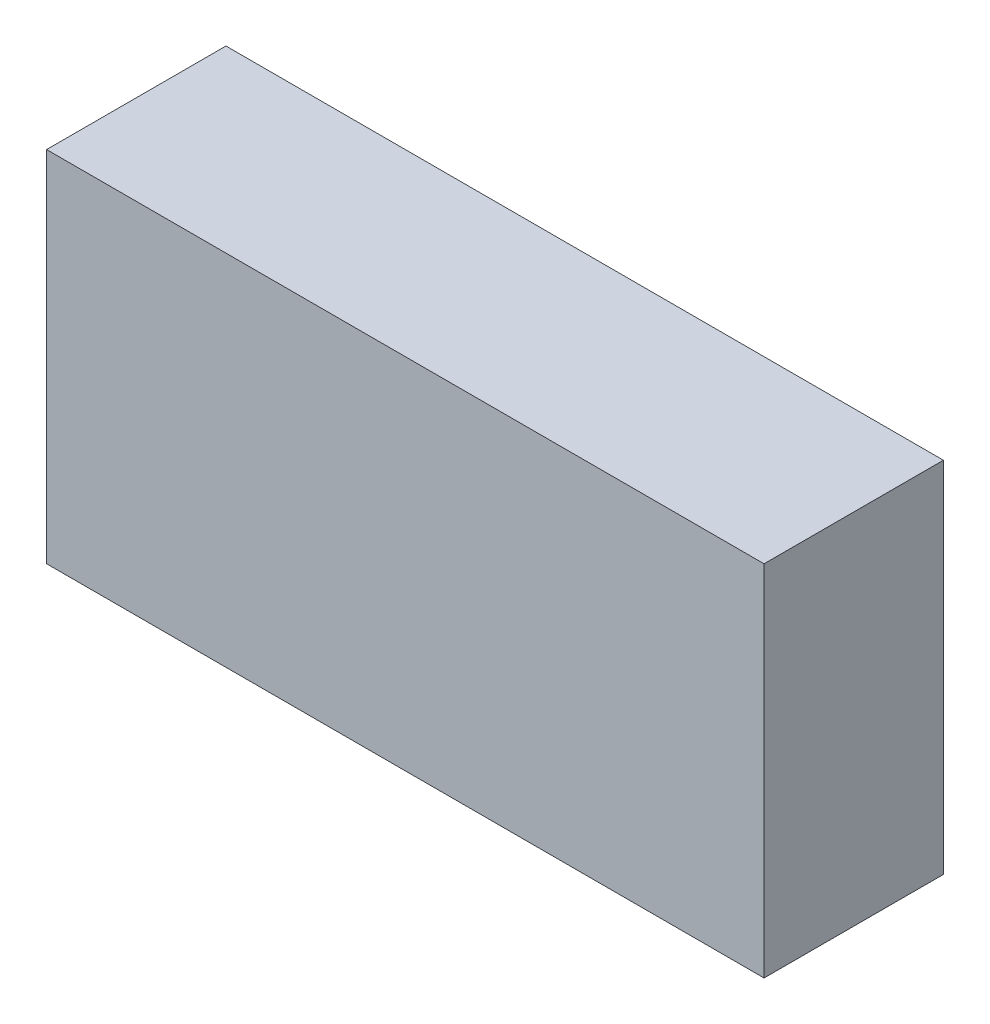
ISO-10303-21;
HEADER;
FILE_DESCRIPTION(('STEP AP214'),'2;1');
FILE_NAME('part.step','',(''),(''),'','','');
FILE_SCHEMA(('AUTOMOTIVE_DESIGN { 1 0 10303 214 1 1 1 1 }'));
ENDSEC;
DATA;
#1=APPLICATION_CONTEXT('core data for automotive mechanical design processes');
#2=APPLICATION_PROTOCOL_DEFINITION('international standard','automotive_design',2000,#1);
#3=PRODUCT_CONTEXT('',#1,'mechanical');
#4=PRODUCT('Part','Part','',(#3));
#5=PRODUCT_RELATED_PRODUCT_CATEGORY('part','',(#4));
#6=PRODUCT_DEFINITION_FORMATION('','',#4);
#7=PRODUCT_DEFINITION_CONTEXT('part definition',#1,'design');
#8=PRODUCT_DEFINITION('design','',#6,#7);
#9=PRODUCT_DEFINITION_SHAPE('','',#8);
#10=(LENGTH_UNIT() NAMED_UNIT(*) SI_UNIT(.MILLI.,.METRE.));
#11=(NAMED_UNIT(*) PLANE_ANGLE_UNIT() SI_UNIT($,.RADIAN.));
#12=(NAMED_UNIT(*) SI_UNIT($,.STERADIAN.) SOLID_ANGLE_UNIT());
#13=UNCERTAINTY_MEASURE_WITH_UNIT(LENGTH_MEASURE(1.E-05),#10,'distance_accuracy_value','');
#14=(GEOMETRIC_REPRESENTATION_CONTEXT(3) GLOBAL_UNCERTAINTY_ASSIGNED_CONTEXT((#13)) GLOBAL_UNIT_ASSIGNED_CONTEXT((#10,
#11,#12)) REPRESENTATION_CONTEXT('',''));
#15=CARTESIAN_POINT('',(0.,0.,0.));
#16=DIRECTION('',(0.,0.,1.));
#17=DIRECTION('',(1.,0.,0.));
#18=AXIS2_PLACEMENT_3D('',#15,#16,#17);
#19=CARTESIAN_POINT('',(-2.,-1.,1.));
#20=DIRECTION('',(1.,0.,0.));
#21=DIRECTION('',(0.,0.,-1.));
#22=AXIS2_PLACEMENT_3D('',#19,#20,#21);
#23=PLANE('',#22);
#24=DIRECTION('',(0.,-1.,0.));
#25=VECTOR('',#24,1.);
#26=CARTESIAN_POINT('',(-2.,-1.,0.));
#27=LINE('',#26,#25);
#28=CARTESIAN_POINT('',(-2.,1.,0.));
#29=VERTEX_POINT('',#28);
#30=CARTESIAN_POINT('',(-2.,-1.,0.));
#31=VERTEX_POINT('',#30);
#32=EDGE_CURVE('E95',#29,#31,#27,.T.);
#33=ORIENTED_EDGE('',*,*,#32,.T.);
#34=DIRECTION('',(0.,0.,-1.));
#35=VECTOR('',#34,1.);
#36=CARTESIAN_POINT('',(-2.,-1.,1.));
#37=LINE('',#36,#35);
#38=CARTESIAN_POINT('',(-2.,-1.,1.));
#39=VERTEX_POINT('',#38);
#40=EDGE_CURVE('E11',#39,#31,#37,.T.);
#41=ORIENTED_EDGE('',*,*,#40,.F.);
#42=DIRECTION('',(0.,-1.,0.));
#43=VECTOR('',#42,1.);
#44=CARTESIAN_POINT('',(-2.,-1.,1.));
#45=LINE('',#44,#43);
#46=CARTESIAN_POINT('',(-2.,1.,1.));
#47=VERTEX_POINT('',#46);
#48=EDGE_CURVE('E83',#47,#39,#45,.T.);
#49=ORIENTED_EDGE('',*,*,#48,.F.);
#50=DIRECTION('',(0.,0.,-1.));
#51=VECTOR('',#50,1.);
#52=CARTESIAN_POINT('',(-2.,1.,1.));
#53=LINE('',#52,#51);
#54=EDGE_CURVE('E91',#47,#29,#53,.T.);
#55=ORIENTED_EDGE('',*,*,#54,.T.);
#56=EDGE_LOOP('',(#33,#41,#49,#55));
#57=FACE_BOUND('',#56,.T.);
#58=ADVANCED_FACE('F32',(#57),#23,.F.);
#59=CARTESIAN_POINT('',(2.,-1.,1.));
#60=DIRECTION('',(0.,1.,0.));
#61=DIRECTION('',(0.,0.,1.));
#62=AXIS2_PLACEMENT_3D('',#59,#60,#61);
#63=PLANE('',#62);
#64=DIRECTION('',(1.,0.,0.));
#65=VECTOR('',#64,1.);
#66=CARTESIAN_POINT('',(2.,-1.,0.));
#67=LINE('',#66,#65);
#68=CARTESIAN_POINT('',(2.,-1.,0.));
#69=VERTEX_POINT('',#68);
#70=EDGE_CURVE('E87',#31,#69,#67,.T.);
#71=ORIENTED_EDGE('',*,*,#70,.T.);
#72=DIRECTION('',(0.,0.,-1.));
#73=VECTOR('',#72,1.);
#74=CARTESIAN_POINT('',(2.,-1.,1.));
#75=LINE('',#74,#73);
#76=CARTESIAN_POINT('',(2.,-1.,1.));
#77=VERTEX_POINT('',#76);
#78=EDGE_CURVE('E40',#77,#69,#75,.T.);
#79=ORIENTED_EDGE('',*,*,#78,.F.);
#80=DIRECTION('',(1.,0.,0.));
#81=VECTOR('',#80,1.);
#82=CARTESIAN_POINT('',(2.,-1.,1.));
#83=LINE('',#82,#81);
#84=EDGE_CURVE('E78',#39,#77,#83,.T.);
#85=ORIENTED_EDGE('',*,*,#84,.F.);
#86=ORIENTED_EDGE('',*,*,#40,.T.);
#87=EDGE_LOOP('',(#71,#79,#85,#86));
#88=FACE_BOUND('',#87,.T.);
#89=ADVANCED_FACE('F86',(#88),#63,.F.);
#90=CARTESIAN_POINT('',(2.,1.,1.));
#91=DIRECTION('',(-1.,0.,0.));
#92=DIRECTION('',(0.,0.,1.));
#93=AXIS2_PLACEMENT_3D('',#90,#91,#92);
#94=PLANE('',#93);
#95=DIRECTION('',(0.,1.,0.));
#96=VECTOR('',#95,1.);
#97=CARTESIAN_POINT('',(2.,1.,0.));
#98=LINE('',#97,#96);
#99=CARTESIAN_POINT('',(2.,1.,0.));
#100=VERTEX_POINT('',#99);
#101=EDGE_CURVE('E65',#69,#100,#98,.T.);
#102=ORIENTED_EDGE('',*,*,#101,.T.);
#103=DIRECTION('',(0.,0.,-1.));
#104=VECTOR('',#103,1.);
#105=CARTESIAN_POINT('',(2.,1.,1.));
#106=LINE('',#105,#104);
#107=CARTESIAN_POINT('',(2.,1.,1.));
#108=VERTEX_POINT('',#107);
#109=EDGE_CURVE('E88',#108,#100,#106,.T.);
#110=ORIENTED_EDGE('',*,*,#109,.F.);
#111=DIRECTION('',(0.,1.,0.));
#112=VECTOR('',#111,1.);
#113=CARTESIAN_POINT('',(2.,1.,1.));
#114=LINE('',#113,#112);
#115=EDGE_CURVE('E81',#77,#108,#114,.T.);
#116=ORIENTED_EDGE('',*,*,#115,.F.);
#117=ORIENTED_EDGE('',*,*,#78,.T.);
#118=EDGE_LOOP('',(#102,#110,#116,#117));
#119=FACE_BOUND('',#118,.T.);
#120=ADVANCED_FACE('F89',(#119),#94,.F.);
#121=CARTESIAN_POINT('',(-2.,1.,1.));
#122=DIRECTION('',(0.,-1.,0.));
#123=DIRECTION('',(0.,0.,-1.));
#124=AXIS2_PLACEMENT_3D('',#121,#122,#123);
#125=PLANE('',#124);
#126=DIRECTION('',(-1.,0.,0.));
#127=VECTOR('',#126,1.);
#128=CARTESIAN_POINT('',(-2.,1.,0.));
#129=LINE('',#128,#127);
#130=EDGE_CURVE('E71',#100,#29,#129,.T.);
#131=ORIENTED_EDGE('',*,*,#130,.T.);
#132=ORIENTED_EDGE('',*,*,#54,.F.);
#133=DIRECTION('',(-1.,0.,0.));
#134=VECTOR('',#133,1.);
#135=CARTESIAN_POINT('',(-2.,1.,1.));
#136=LINE('',#135,#134);
#137=EDGE_CURVE('E48',#108,#47,#136,.T.);
#138=ORIENTED_EDGE('',*,*,#137,.F.);
#139=ORIENTED_EDGE('',*,*,#109,.T.);
#140=EDGE_LOOP('',(#131,#132,#138,#139));
#141=FACE_BOUND('',#140,.T.);
#142=ADVANCED_FACE('F102',(#141),#125,.F.);
#143=CARTESIAN_POINT('',(0.,0.,1.));
#144=DIRECTION('',(0.,0.,-1.));
#145=DIRECTION('',(-1.,0.,0.));
#146=AXIS2_PLACEMENT_3D('',#143,#144,#145);
#147=PLANE('',#146);
#148=ORIENTED_EDGE('',*,*,#48,.T.);
#149=ORIENTED_EDGE('',*,*,#84,.T.);
#150=ORIENTED_EDGE('',*,*,#115,.T.);
#151=ORIENTED_EDGE('',*,*,#137,.T.);
#152=EDGE_LOOP('',(#148,#149,#150,#151));
#153=FACE_BOUND('',#152,.T.);
#154=ADVANCED_FACE('F79',(#153),#147,.F.);
#155=CARTESIAN_POINT('',(0.,0.,0.));
#156=DIRECTION('',(0.,0.,-1.));
#157=DIRECTION('',(-1.,0.,0.));
#158=AXIS2_PLACEMENT_3D('',#155,#156,#157);
#159=PLANE('',#158);
#160=ORIENTED_EDGE('',*,*,#32,.F.);
#161=ORIENTED_EDGE('',*,*,#130,.F.);
#162=ORIENTED_EDGE('',*,*,#101,.F.);
#163=ORIENTED_EDGE('',*,*,#70,.F.);
#164=EDGE_LOOP('',(#160,#161,#162,#163));
#165=FACE_BOUND('',#164,.T.);
#166=ADVANCED_FACE('F105',(#165),#159,.T.);
#167=CLOSED_SHELL('',(#58,#89,#120,#142,#154,#166));
#168=MANIFOLD_SOLID_BREP('B2',#167);
#169=ADVANCED_BREP_SHAPE_REPRESENTATION('',(#18,#168),#14);
#170=SHAPE_DEFINITION_REPRESENTATION(#9,#169);
ENDSEC;
END-ISO-10303-21;
